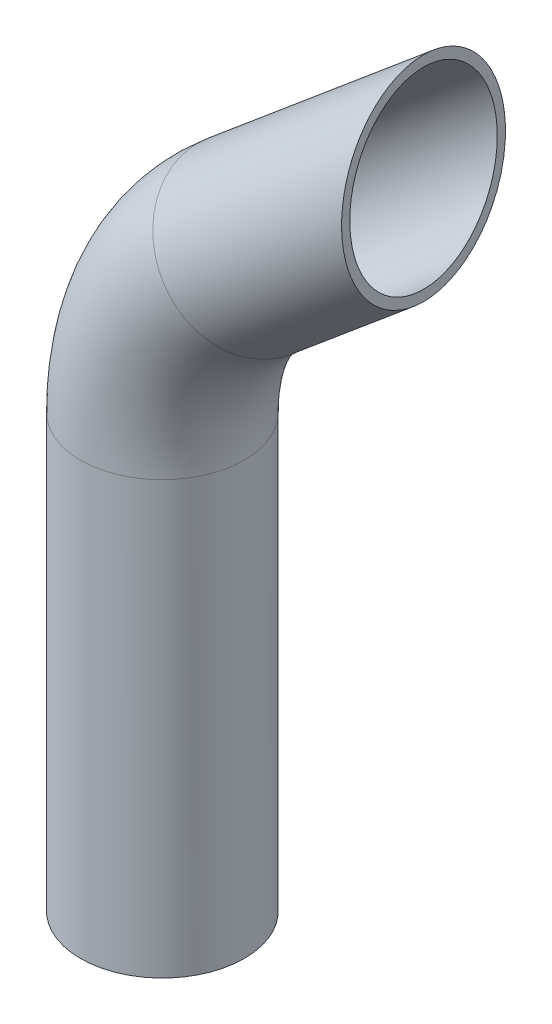
ISO-10303-21;
HEADER;
FILE_DESCRIPTION(('STEP AP214'),'2;1');
FILE_NAME('part.step','',(''),(''),'','','');
FILE_SCHEMA(('AUTOMOTIVE_DESIGN { 1 0 10303 214 1 1 1 1 }'));
ENDSEC;
DATA;
#1=APPLICATION_CONTEXT('core data for automotive mechanical design processes');
#2=APPLICATION_PROTOCOL_DEFINITION('international standard','automotive_design',2000,#1);
#3=PRODUCT_CONTEXT('',#1,'mechanical');
#4=PRODUCT('Part','Part','',(#3));
#5=PRODUCT_RELATED_PRODUCT_CATEGORY('part','',(#4));
#6=PRODUCT_DEFINITION_FORMATION('','',#4);
#7=PRODUCT_DEFINITION_CONTEXT('part definition',#1,'design');
#8=PRODUCT_DEFINITION('design','',#6,#7);
#9=PRODUCT_DEFINITION_SHAPE('','',#8);
#10=(LENGTH_UNIT() NAMED_UNIT(*) SI_UNIT(.MILLI.,.METRE.));
#11=(NAMED_UNIT(*) PLANE_ANGLE_UNIT() SI_UNIT($,.RADIAN.));
#12=(NAMED_UNIT(*) SI_UNIT($,.STERADIAN.) SOLID_ANGLE_UNIT());
#13=UNCERTAINTY_MEASURE_WITH_UNIT(LENGTH_MEASURE(1.E-05),#10,'distance_accuracy_value','');
#14=(GEOMETRIC_REPRESENTATION_CONTEXT(3) GLOBAL_UNCERTAINTY_ASSIGNED_CONTEXT((#13)) GLOBAL_UNIT_ASSIGNED_CONTEXT((#10,
#11,#12)) REPRESENTATION_CONTEXT('',''));
#15=CARTESIAN_POINT('',(0.,0.,0.));
#16=DIRECTION('',(0.,0.,1.));
#17=DIRECTION('',(1.,0.,0.));
#18=AXIS2_PLACEMENT_3D('',#15,#16,#17);
#19=CARTESIAN_POINT('',(0.,-144.479334257975,0.));
#20=DIRECTION('',(0.,-1.,0.));
#21=DIRECTION('',(1.,0.,0.));
#22=AXIS2_PLACEMENT_3D('',#19,#20,#21);
#23=PLANE('',#22);
#24=CARTESIAN_POINT('',(0.,-144.479334257975,0.));
#25=DIRECTION('',(0.,-1.,0.));
#26=DIRECTION('',(1.,0.,0.));
#27=AXIS2_PLACEMENT_3D('',#24,#25,#26);
#28=CIRCLE('',#27,27.);
#29=CARTESIAN_POINT('',(27.,-144.479334257975,0.));
#30=VERTEX_POINT('',#29);
#31=EDGE_CURVE('E52',#30,#30,#28,.T.);
#32=ORIENTED_EDGE('',*,*,#31,.F.);
#33=EDGE_LOOP('',(#32));
#34=FACE_BOUND('',#33,.T.);
#35=CARTESIAN_POINT('',(0.,-144.479334257975,0.));
#36=DIRECTION('',(0.,-1.,0.));
#37=DIRECTION('',(1.,0.,0.));
#38=AXIS2_PLACEMENT_3D('',#35,#36,#37);
#39=CIRCLE('',#38,30.);
#40=CARTESIAN_POINT('',(30.,-144.479334257975,0.));
#41=VERTEX_POINT('',#40);
#42=EDGE_CURVE('E46',#41,#41,#39,.T.);
#43=ORIENTED_EDGE('',*,*,#42,.T.);
#44=EDGE_LOOP('',(#43));
#45=FACE_BOUND('',#44,.T.);
#46=ADVANCED_FACE('F35',(#34,#45),#23,.T.);
#47=CARTESIAN_POINT('',(0.,-144.479334257975,0.));
#48=DIRECTION('',(0.,1.,0.));
#49=DIRECTION('',(0.,0.,1.));
#50=AXIS2_PLACEMENT_3D('',#47,#48,#49);
#51=CYLINDRICAL_SURFACE('',#50,30.);
#52=CARTESIAN_POINT('',(0.,13.5529765080745,0.));
#53=DIRECTION('',(0.,-1.,0.));
#54=DIRECTION('',(1.,0.,0.));
#55=AXIS2_PLACEMENT_3D('',#52,#53,#54);
#56=CIRCLE('',#55,30.);
#57=CARTESIAN_POINT('',(-30.,13.5529765080744,0.));
#58=VERTEX_POINT('',#57);
#59=EDGE_CURVE('E42',#58,#58,#56,.T.);
#60=ORIENTED_EDGE('',*,*,#59,.T.);
#61=EDGE_LOOP('',(#60));
#62=FACE_BOUND('',#61,.T.);
#63=ORIENTED_EDGE('',*,*,#42,.F.);
#64=EDGE_LOOP('',(#63));
#65=FACE_BOUND('',#64,.T.);
#66=ADVANCED_FACE('F91',(#62,#65),#51,.T.);
#67=CARTESIAN_POINT('',(90.,13.552976508075,0.));
#68=DIRECTION('',(0.,0.,-1.));
#69=DIRECTION('',(-1.,0.,0.));
#70=AXIS2_PLACEMENT_3D('',#67,#68,#69);
#71=TOROIDAL_SURFACE('',#70,90.,30.);
#72=CARTESIAN_POINT('',(32.1491151282113,82.4969763887838,0.));
#73=DIRECTION('',(-0.766044443118979,-0.642787609686538,0.));
#74=DIRECTION('',(0.642787609686538,-0.766044443118979,0.));
#75=AXIS2_PLACEMENT_3D('',#72,#73,#74);
#76=CIRCLE('',#75,30.);
#77=CARTESIAN_POINT('',(12.8654868376157,105.478309682353,0.));
#78=VERTEX_POINT('',#77);
#79=EDGE_CURVE('E10',#78,#78,#76,.T.);
#80=CARTESIAN_POINT('',(90.,13.552976508075,0.));
#81=DIRECTION('',(0.,0.,-1.));
#82=DIRECTION('',(-1.,0.,0.));
#83=AXIS2_PLACEMENT_3D('',#80,#81,#82);
#84=CIRCLE('',#83,120.);
#85=EDGE_CURVE('',#58,#78,#84,.T.);
#86=ORIENTED_EDGE('',*,*,#59,.F.);
#87=ORIENTED_EDGE('',*,*,#79,.T.);
#88=ORIENTED_EDGE('',*,*,#85,.T.);
#89=ORIENTED_EDGE('',*,*,#85,.F.);
#90=EDGE_LOOP('',(#86,#88,#87,#89));
#91=FACE_BOUND('',#90,.T.);
#92=ADVANCED_FACE('F95',(#91),#71,.T.);
#93=CARTESIAN_POINT('',(32.1491151282119,82.4969763887833,0.));
#94=DIRECTION('',(0.766044443118979,0.642787609686538,0.));
#95=DIRECTION('',(-0.642787609686538,0.766044443118979,0.));
#96=AXIS2_PLACEMENT_3D('',#93,#94,#95);
#97=CYLINDRICAL_SURFACE('',#96,30.);
#98=CARTESIAN_POINT('',(95.6230381772508,135.757921808607,0.));
#99=DIRECTION('',(-1.,0.,0.));
#100=DIRECTION('',(0.,1.,0.));
#101=AXIS2_PLACEMENT_3D('',#98,#99,#100);
#102=ELLIPSE('',#101,39.1622186799683,30.);
#103=CARTESIAN_POINT('',(95.6230381772508,174.920140488575,0.));
#104=VERTEX_POINT('',#103);
#105=EDGE_CURVE('E56',#104,#104,#102,.T.);
#106=ORIENTED_EDGE('',*,*,#105,.T.);
#107=EDGE_LOOP('',(#106));
#108=FACE_BOUND('',#107,.T.);
#109=ORIENTED_EDGE('',*,*,#79,.F.);
#110=EDGE_LOOP('',(#109));
#111=FACE_BOUND('',#110,.T.);
#112=ADVANCED_FACE('F85',(#108,#111),#97,.T.);
#113=CARTESIAN_POINT('',(0.,-144.479334257975,0.));
#114=DIRECTION('',(0.,1.,0.));
#115=DIRECTION('',(0.,0.,1.));
#116=AXIS2_PLACEMENT_3D('',#113,#114,#115);
#117=CYLINDRICAL_SURFACE('',#116,27.);
#118=CARTESIAN_POINT('',(0.,13.5529765080745,0.));
#119=DIRECTION('',(0.,1.,0.));
#120=DIRECTION('',(0.,0.,1.));
#121=AXIS2_PLACEMENT_3D('',#118,#119,#120);
#122=CIRCLE('',#121,27.);
#123=CARTESIAN_POINT('',(-27.,13.5529765080744,0.));
#124=VERTEX_POINT('',#123);
#125=EDGE_CURVE('E55',#124,#124,#122,.F.);
#126=ORIENTED_EDGE('',*,*,#125,.F.);
#127=EDGE_LOOP('',(#126));
#128=FACE_BOUND('',#127,.T.);
#129=ORIENTED_EDGE('',*,*,#31,.T.);
#130=EDGE_LOOP('',(#129));
#131=FACE_BOUND('',#130,.T.);
#132=ADVANCED_FACE('F79',(#128,#131),#117,.F.);
#133=CARTESIAN_POINT('',(90.,13.552976508075,0.));
#134=DIRECTION('',(0.,0.,-1.));
#135=DIRECTION('',(-1.,0.,0.));
#136=AXIS2_PLACEMENT_3D('',#133,#134,#135);
#137=TOROIDAL_SURFACE('',#136,90.,27.);
#138=CARTESIAN_POINT('',(32.1491151282117,82.4969763887832,0.));
#139=DIRECTION('',(-0.76604444311898,-0.642787609686537,0.));
#140=DIRECTION('',(0.642787609686537,-0.76604444311898,0.));
#141=AXIS2_PLACEMENT_3D('',#138,#139,#140);
#142=CIRCLE('',#141,27.);
#143=CARTESIAN_POINT('',(14.7938496666752,103.180176352996,0.));
#144=VERTEX_POINT('',#143);
#145=EDGE_CURVE('E51',#144,#144,#142,.T.);
#146=CARTESIAN_POINT('',(90.,13.552976508075,0.));
#147=DIRECTION('',(0.,0.,-1.));
#148=DIRECTION('',(-1.,0.,0.));
#149=AXIS2_PLACEMENT_3D('',#146,#147,#148);
#150=CIRCLE('',#149,117.);
#151=EDGE_CURVE('',#124,#144,#150,.T.);
#152=ORIENTED_EDGE('',*,*,#125,.T.);
#153=ORIENTED_EDGE('',*,*,#145,.F.);
#154=ORIENTED_EDGE('',*,*,#151,.T.);
#155=ORIENTED_EDGE('',*,*,#151,.F.);
#156=EDGE_LOOP('',(#152,#154,#153,#155));
#157=FACE_BOUND('',#156,.T.);
#158=ADVANCED_FACE('F73',(#157),#137,.F.);
#159=CARTESIAN_POINT('',(32.1491151282119,82.4969763887833,0.));
#160=DIRECTION('',(0.766044443118979,0.642787609686538,0.));
#161=DIRECTION('',(-0.642787609686538,0.766044443118979,0.));
#162=AXIS2_PLACEMENT_3D('',#159,#160,#161);
#163=CYLINDRICAL_SURFACE('',#162,27.);
#164=CARTESIAN_POINT('',(95.6230381772508,135.757921808607,0.));
#165=DIRECTION('',(-1.,0.,0.));
#166=DIRECTION('',(0.,1.,0.));
#167=AXIS2_PLACEMENT_3D('',#164,#165,#166);
#168=ELLIPSE('',#167,35.2459968119714,27.);
#169=CARTESIAN_POINT('',(95.6230381772508,171.003918620578,0.));
#170=VERTEX_POINT('',#169);
#171=EDGE_CURVE('E38',#170,#170,#168,.T.);
#172=ORIENTED_EDGE('',*,*,#171,.F.);
#173=EDGE_LOOP('',(#172));
#174=FACE_BOUND('',#173,.T.);
#175=ORIENTED_EDGE('',*,*,#145,.T.);
#176=EDGE_LOOP('',(#175));
#177=FACE_BOUND('',#176,.T.);
#178=ADVANCED_FACE('F70',(#174,#177),#163,.F.);
#179=CARTESIAN_POINT('',(95.6230381772508,174.920140488575,-40.));
#180=DIRECTION('',(-1.,0.,0.));
#181=DIRECTION('',(0.,-1.,0.));
#182=AXIS2_PLACEMENT_3D('',#179,#180,#181);
#183=PLANE('',#182);
#184=ORIENTED_EDGE('',*,*,#171,.T.);
#185=EDGE_LOOP('',(#184));
#186=FACE_BOUND('',#185,.T.);
#187=ORIENTED_EDGE('',*,*,#105,.F.);
#188=EDGE_LOOP('',(#187));
#189=FACE_BOUND('',#188,.T.);
#190=ADVANCED_FACE('F67',(#186,#189),#183,.F.);
#191=CLOSED_SHELL('',(#46,#66,#92,#112,#132,#158,#178,#190));
#192=MANIFOLD_SOLID_BREP('B2',#191);
#193=ADVANCED_BREP_SHAPE_REPRESENTATION('',(#18,#192),#14);
#194=SHAPE_DEFINITION_REPRESENTATION(#9,#193);
ENDSEC;
END-ISO-10303-21;
